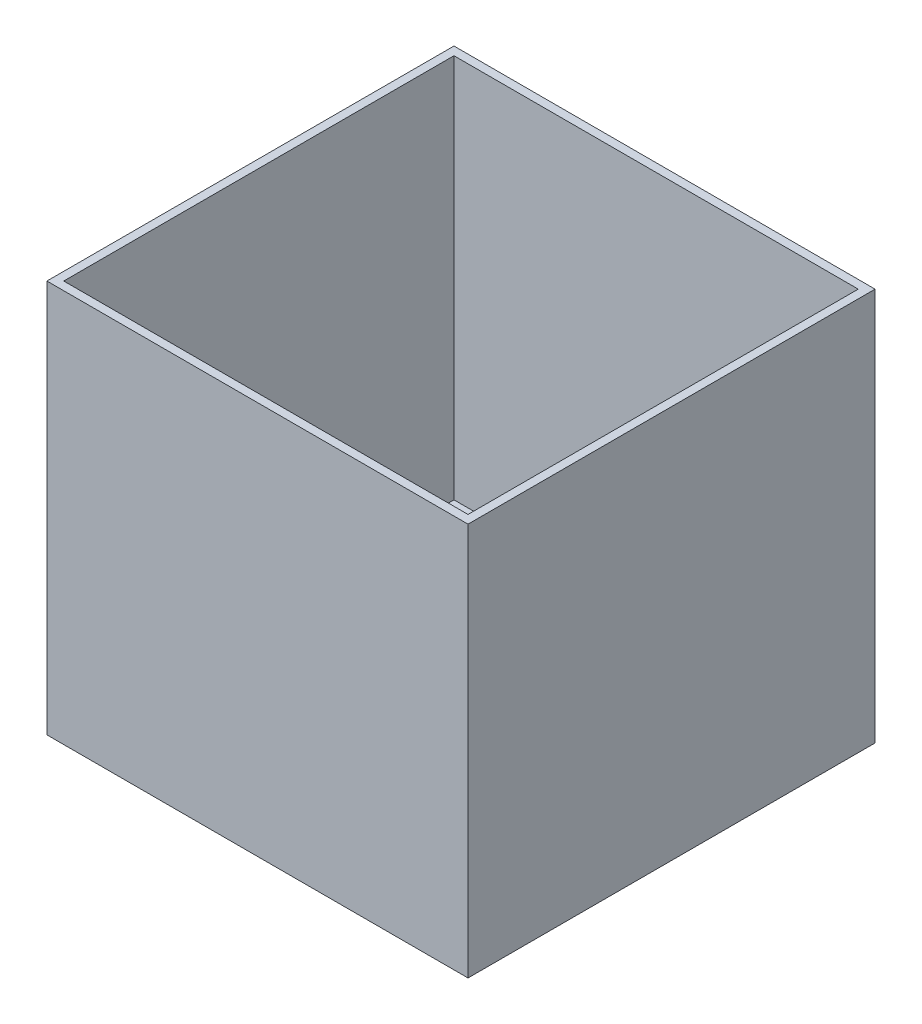
ISO-10303-21;
HEADER;
FILE_DESCRIPTION(('STEP AP214'),'2;1');
FILE_NAME('part.step','',(''),(''),'','','');
FILE_SCHEMA(('AUTOMOTIVE_DESIGN { 1 0 10303 214 1 1 1 1 }'));
ENDSEC;
DATA;
#1=APPLICATION_CONTEXT('core data for automotive mechanical design processes');
#2=APPLICATION_PROTOCOL_DEFINITION('international standard','automotive_design',2000,#1);
#3=PRODUCT_CONTEXT('',#1,'mechanical');
#4=PRODUCT('Part','Part','',(#3));
#5=PRODUCT_RELATED_PRODUCT_CATEGORY('part','',(#4));
#6=PRODUCT_DEFINITION_FORMATION('','',#4);
#7=PRODUCT_DEFINITION_CONTEXT('part definition',#1,'design');
#8=PRODUCT_DEFINITION('design','',#6,#7);
#9=PRODUCT_DEFINITION_SHAPE('','',#8);
#10=(LENGTH_UNIT() NAMED_UNIT(*) SI_UNIT(.MILLI.,.METRE.));
#11=(NAMED_UNIT(*) PLANE_ANGLE_UNIT() SI_UNIT($,.RADIAN.));
#12=(NAMED_UNIT(*) SI_UNIT($,.STERADIAN.) SOLID_ANGLE_UNIT());
#13=UNCERTAINTY_MEASURE_WITH_UNIT(LENGTH_MEASURE(1.E-05),#10,'distance_accuracy_value','');
#14=(GEOMETRIC_REPRESENTATION_CONTEXT(3) GLOBAL_UNCERTAINTY_ASSIGNED_CONTEXT((#13)) GLOBAL_UNIT_ASSIGNED_CONTEXT((#10,
#11,#12)) REPRESENTATION_CONTEXT('',''));
#15=CARTESIAN_POINT('',(0.,0.,0.));
#16=DIRECTION('',(0.,0.,1.));
#17=DIRECTION('',(1.,0.,0.));
#18=AXIS2_PLACEMENT_3D('',#15,#16,#17);
#19=CARTESIAN_POINT('',(72.,140.,-72.5));
#20=DIRECTION('',(-1.,0.,0.));
#21=DIRECTION('',(0.,0.,1.));
#22=AXIS2_PLACEMENT_3D('',#19,#20,#21);
#23=PLANE('',#22);
#24=DIRECTION('',(0.,-1.,0.));
#25=VECTOR('',#24,1.);
#26=CARTESIAN_POINT('',(72.,140.,-69.5));
#27=LINE('',#26,#25);
#28=CARTESIAN_POINT('',(72.,140.,-69.5));
#29=VERTEX_POINT('',#28);
#30=CARTESIAN_POINT('',(72.,3.,-69.5));
#31=VERTEX_POINT('',#30);
#32=EDGE_CURVE('E51',#29,#31,#27,.T.);
#33=ORIENTED_EDGE('',*,*,#32,.T.);
#34=DIRECTION('',(0.,0.,-1.));
#35=VECTOR('',#34,1.);
#36=CARTESIAN_POINT('',(72.,3.,-72.5));
#37=LINE('',#36,#35);
#38=CARTESIAN_POINT('',(72.,3.,69.5));
#39=VERTEX_POINT('',#38);
#40=EDGE_CURVE('E38',#39,#31,#37,.T.);
#41=ORIENTED_EDGE('',*,*,#40,.F.);
#42=DIRECTION('',(0.,-1.,0.));
#43=VECTOR('',#42,1.);
#44=CARTESIAN_POINT('',(72.,140.,69.5));
#45=LINE('',#44,#43);
#46=CARTESIAN_POINT('',(72.,140.,69.5));
#47=VERTEX_POINT('',#46);
#48=EDGE_CURVE('E167',#47,#39,#45,.T.);
#49=ORIENTED_EDGE('',*,*,#48,.F.);
#50=DIRECTION('',(0.,0.,-1.));
#51=VECTOR('',#50,1.);
#52=CARTESIAN_POINT('',(72.,140.,0.));
#53=LINE('',#52,#51);
#54=EDGE_CURVE('E132',#47,#29,#53,.T.);
#55=ORIENTED_EDGE('',*,*,#54,.T.);
#56=EDGE_LOOP('',(#33,#41,#49,#55));
#57=FACE_BOUND('',#56,.T.);
#58=ADVANCED_FACE('F34',(#57),#23,.T.);
#59=CARTESIAN_POINT('',(-75.,140.,-69.5));
#60=DIRECTION('',(0.,0.,1.));
#61=DIRECTION('',(1.,0.,0.));
#62=AXIS2_PLACEMENT_3D('',#59,#60,#61);
#63=PLANE('',#62);
#64=DIRECTION('',(0.,-1.,0.));
#65=VECTOR('',#64,1.);
#66=CARTESIAN_POINT('',(-72.,140.,-69.5));
#67=LINE('',#66,#65);
#68=CARTESIAN_POINT('',(-72.,140.,-69.5));
#69=VERTEX_POINT('',#68);
#70=CARTESIAN_POINT('',(-72.,3.,-69.5));
#71=VERTEX_POINT('',#70);
#72=EDGE_CURVE('E68',#69,#71,#67,.T.);
#73=ORIENTED_EDGE('',*,*,#72,.T.);
#74=DIRECTION('',(-1.,0.,0.));
#75=VECTOR('',#74,1.);
#76=CARTESIAN_POINT('',(-75.,3.,-69.5));
#77=LINE('',#76,#75);
#78=EDGE_CURVE('E166',#31,#71,#77,.T.);
#79=ORIENTED_EDGE('',*,*,#78,.F.);
#80=ORIENTED_EDGE('',*,*,#32,.F.);
#81=DIRECTION('',(-1.,0.,0.));
#82=VECTOR('',#81,1.);
#83=CARTESIAN_POINT('',(0.,140.,-69.5));
#84=LINE('',#83,#82);
#85=EDGE_CURVE('E128',#29,#69,#84,.T.);
#86=ORIENTED_EDGE('',*,*,#85,.T.);
#87=EDGE_LOOP('',(#73,#79,#80,#86));
#88=FACE_BOUND('',#87,.T.);
#89=ADVANCED_FACE('F129',(#88),#63,.T.);
#90=CARTESIAN_POINT('',(-72.,140.,-72.5));
#91=DIRECTION('',(1.,0.,0.));
#92=DIRECTION('',(0.,0.,-1.));
#93=AXIS2_PLACEMENT_3D('',#90,#91,#92);
#94=PLANE('',#93);
#95=DIRECTION('',(0.,-1.,0.));
#96=VECTOR('',#95,1.);
#97=CARTESIAN_POINT('',(-72.,140.,69.5));
#98=LINE('',#97,#96);
#99=CARTESIAN_POINT('',(-72.,140.,69.5));
#100=VERTEX_POINT('',#99);
#101=CARTESIAN_POINT('',(-72.,3.,69.5));
#102=VERTEX_POINT('',#101);
#103=EDGE_CURVE('E11',#100,#102,#98,.T.);
#104=ORIENTED_EDGE('',*,*,#103,.T.);
#105=DIRECTION('',(0.,0.,1.));
#106=VECTOR('',#105,1.);
#107=CARTESIAN_POINT('',(-72.,3.,-72.5));
#108=LINE('',#107,#106);
#109=EDGE_CURVE('E125',#71,#102,#108,.T.);
#110=ORIENTED_EDGE('',*,*,#109,.F.);
#111=ORIENTED_EDGE('',*,*,#72,.F.);
#112=DIRECTION('',(0.,0.,1.));
#113=VECTOR('',#112,1.);
#114=CARTESIAN_POINT('',(-72.,140.,0.));
#115=LINE('',#114,#113);
#116=EDGE_CURVE('E122',#69,#100,#115,.T.);
#117=ORIENTED_EDGE('',*,*,#116,.T.);
#118=EDGE_LOOP('',(#104,#110,#111,#117));
#119=FACE_BOUND('',#118,.T.);
#120=ADVANCED_FACE('F120',(#119),#94,.T.);
#121=CARTESIAN_POINT('',(-75.,140.,69.5));
#122=DIRECTION('',(0.,0.,-1.));
#123=DIRECTION('',(-1.,0.,0.));
#124=AXIS2_PLACEMENT_3D('',#121,#122,#123);
#125=PLANE('',#124);
#126=ORIENTED_EDGE('',*,*,#48,.T.);
#127=DIRECTION('',(1.,0.,0.));
#128=VECTOR('',#127,1.);
#129=CARTESIAN_POINT('',(-75.,3.,69.5));
#130=LINE('',#129,#128);
#131=EDGE_CURVE('E43',#102,#39,#130,.T.);
#132=ORIENTED_EDGE('',*,*,#131,.F.);
#133=ORIENTED_EDGE('',*,*,#103,.F.);
#134=DIRECTION('',(1.,0.,0.));
#135=VECTOR('',#134,1.);
#136=CARTESIAN_POINT('',(0.,140.,69.5));
#137=LINE('',#136,#135);
#138=EDGE_CURVE('E136',#100,#47,#137,.T.);
#139=ORIENTED_EDGE('',*,*,#138,.T.);
#140=EDGE_LOOP('',(#126,#132,#133,#139));
#141=FACE_BOUND('',#140,.T.);
#142=ADVANCED_FACE('F172',(#141),#125,.T.);
#143=CARTESIAN_POINT('',(0.,3.,0.));
#144=DIRECTION('',(0.,1.,0.));
#145=DIRECTION('',(0.,0.,1.));
#146=AXIS2_PLACEMENT_3D('',#143,#144,#145);
#147=PLANE('',#146);
#148=ORIENTED_EDGE('',*,*,#40,.T.);
#149=ORIENTED_EDGE('',*,*,#78,.T.);
#150=ORIENTED_EDGE('',*,*,#109,.T.);
#151=ORIENTED_EDGE('',*,*,#131,.T.);
#152=EDGE_LOOP('',(#148,#149,#150,#151));
#153=FACE_BOUND('',#152,.T.);
#154=ADVANCED_FACE('F36',(#153),#147,.T.);
#155=CARTESIAN_POINT('',(75.,140.,-72.5));
#156=DIRECTION('',(-1.,0.,0.));
#157=DIRECTION('',(0.,0.,1.));
#158=AXIS2_PLACEMENT_3D('',#155,#156,#157);
#159=PLANE('',#158);
#160=DIRECTION('',(0.,0.,-1.));
#161=VECTOR('',#160,1.);
#162=CARTESIAN_POINT('',(75.,0.,-72.5));
#163=LINE('',#162,#161);
#164=CARTESIAN_POINT('',(75.,0.,72.5));
#165=VERTEX_POINT('',#164);
#166=CARTESIAN_POINT('',(75.,0.,-72.5));
#167=VERTEX_POINT('',#166);
#168=EDGE_CURVE('E138',#165,#167,#163,.T.);
#169=ORIENTED_EDGE('',*,*,#168,.T.);
#170=DIRECTION('',(0.,-1.,0.));
#171=VECTOR('',#170,1.);
#172=CARTESIAN_POINT('',(75.,140.,-72.5));
#173=LINE('',#172,#171);
#174=CARTESIAN_POINT('',(75.,140.,-72.5));
#175=VERTEX_POINT('',#174);
#176=EDGE_CURVE('E160',#175,#167,#173,.T.);
#177=ORIENTED_EDGE('',*,*,#176,.F.);
#178=DIRECTION('',(0.,0.,-1.));
#179=VECTOR('',#178,1.);
#180=CARTESIAN_POINT('',(75.,140.,-72.5));
#181=LINE('',#180,#179);
#182=CARTESIAN_POINT('',(75.,140.,72.5));
#183=VERTEX_POINT('',#182);
#184=EDGE_CURVE('E142',#183,#175,#181,.T.);
#185=ORIENTED_EDGE('',*,*,#184,.F.);
#186=DIRECTION('',(0.,-1.,0.));
#187=VECTOR('',#186,1.);
#188=CARTESIAN_POINT('',(75.,140.,72.5));
#189=LINE('',#188,#187);
#190=EDGE_CURVE('E148',#183,#165,#189,.T.);
#191=ORIENTED_EDGE('',*,*,#190,.T.);
#192=EDGE_LOOP('',(#169,#177,#185,#191));
#193=FACE_BOUND('',#192,.T.);
#194=ADVANCED_FACE('F178',(#193),#159,.F.);
#195=CARTESIAN_POINT('',(-75.,140.,-72.5));
#196=DIRECTION('',(0.,0.,1.));
#197=DIRECTION('',(1.,0.,0.));
#198=AXIS2_PLACEMENT_3D('',#195,#196,#197);
#199=PLANE('',#198);
#200=DIRECTION('',(-1.,0.,0.));
#201=VECTOR('',#200,1.);
#202=CARTESIAN_POINT('',(-75.,0.,-72.5));
#203=LINE('',#202,#201);
#204=CARTESIAN_POINT('',(-75.,0.,-72.5));
#205=VERTEX_POINT('',#204);
#206=EDGE_CURVE('E151',#167,#205,#203,.T.);
#207=ORIENTED_EDGE('',*,*,#206,.T.);
#208=DIRECTION('',(0.,-1.,0.));
#209=VECTOR('',#208,1.);
#210=CARTESIAN_POINT('',(-75.,140.,-72.5));
#211=LINE('',#210,#209);
#212=CARTESIAN_POINT('',(-75.,140.,-72.5));
#213=VERTEX_POINT('',#212);
#214=EDGE_CURVE('E158',#213,#205,#211,.T.);
#215=ORIENTED_EDGE('',*,*,#214,.F.);
#216=DIRECTION('',(-1.,0.,0.));
#217=VECTOR('',#216,1.);
#218=CARTESIAN_POINT('',(-75.,140.,-72.5));
#219=LINE('',#218,#217);
#220=EDGE_CURVE('E109',#175,#213,#219,.T.);
#221=ORIENTED_EDGE('',*,*,#220,.F.);
#222=ORIENTED_EDGE('',*,*,#176,.T.);
#223=EDGE_LOOP('',(#207,#215,#221,#222));
#224=FACE_BOUND('',#223,.T.);
#225=ADVANCED_FACE('F189',(#224),#199,.F.);
#226=CARTESIAN_POINT('',(-75.,140.,-72.5));
#227=DIRECTION('',(1.,0.,0.));
#228=DIRECTION('',(0.,0.,-1.));
#229=AXIS2_PLACEMENT_3D('',#226,#227,#228);
#230=PLANE('',#229);
#231=DIRECTION('',(0.,0.,1.));
#232=VECTOR('',#231,1.);
#233=CARTESIAN_POINT('',(-75.,0.,-72.5));
#234=LINE('',#233,#232);
#235=CARTESIAN_POINT('',(-75.,0.,72.5));
#236=VERTEX_POINT('',#235);
#237=EDGE_CURVE('E95',#205,#236,#234,.T.);
#238=ORIENTED_EDGE('',*,*,#237,.T.);
#239=DIRECTION('',(0.,-1.,0.));
#240=VECTOR('',#239,1.);
#241=CARTESIAN_POINT('',(-75.,140.,72.5));
#242=LINE('',#241,#240);
#243=CARTESIAN_POINT('',(-75.,140.,72.5));
#244=VERTEX_POINT('',#243);
#245=EDGE_CURVE('E156',#244,#236,#242,.T.);
#246=ORIENTED_EDGE('',*,*,#245,.F.);
#247=DIRECTION('',(0.,0.,1.));
#248=VECTOR('',#247,1.);
#249=CARTESIAN_POINT('',(-75.,140.,-72.5));
#250=LINE('',#249,#248);
#251=EDGE_CURVE('E145',#213,#244,#250,.T.);
#252=ORIENTED_EDGE('',*,*,#251,.F.);
#253=ORIENTED_EDGE('',*,*,#214,.T.);
#254=EDGE_LOOP('',(#238,#246,#252,#253));
#255=FACE_BOUND('',#254,.T.);
#256=ADVANCED_FACE('F193',(#255),#230,.F.);
#257=CARTESIAN_POINT('',(-75.,140.,72.5));
#258=DIRECTION('',(0.,0.,-1.));
#259=DIRECTION('',(-1.,0.,0.));
#260=AXIS2_PLACEMENT_3D('',#257,#258,#259);
#261=PLANE('',#260);
#262=DIRECTION('',(1.,0.,0.));
#263=VECTOR('',#262,1.);
#264=CARTESIAN_POINT('',(-75.,0.,72.5));
#265=LINE('',#264,#263);
#266=EDGE_CURVE('E101',#236,#165,#265,.T.);
#267=ORIENTED_EDGE('',*,*,#266,.T.);
#268=ORIENTED_EDGE('',*,*,#190,.F.);
#269=DIRECTION('',(1.,0.,0.));
#270=VECTOR('',#269,1.);
#271=CARTESIAN_POINT('',(-75.,140.,72.5));
#272=LINE('',#271,#270);
#273=EDGE_CURVE('E77',#244,#183,#272,.T.);
#274=ORIENTED_EDGE('',*,*,#273,.F.);
#275=ORIENTED_EDGE('',*,*,#245,.T.);
#276=EDGE_LOOP('',(#267,#268,#274,#275));
#277=FACE_BOUND('',#276,.T.);
#278=ADVANCED_FACE('F196',(#277),#261,.F.);
#279=CARTESIAN_POINT('',(0.,140.,0.));
#280=DIRECTION('',(0.,1.,0.));
#281=DIRECTION('',(0.,0.,1.));
#282=AXIS2_PLACEMENT_3D('',#279,#280,#281);
#283=PLANE('',#282);
#284=ORIENTED_EDGE('',*,*,#54,.F.);
#285=ORIENTED_EDGE('',*,*,#138,.F.);
#286=ORIENTED_EDGE('',*,*,#116,.F.);
#287=ORIENTED_EDGE('',*,*,#85,.F.);
#288=EDGE_LOOP('',(#284,#285,#286,#287));
#289=FACE_BOUND('',#288,.T.);
#290=ORIENTED_EDGE('',*,*,#184,.T.);
#291=ORIENTED_EDGE('',*,*,#220,.T.);
#292=ORIENTED_EDGE('',*,*,#251,.T.);
#293=ORIENTED_EDGE('',*,*,#273,.T.);
#294=EDGE_LOOP('',(#290,#291,#292,#293));
#295=FACE_BOUND('',#294,.T.);
#296=ADVANCED_FACE('F134',(#289,#295),#283,.T.);
#297=CARTESIAN_POINT('',(0.,0.,0.));
#298=DIRECTION('',(0.,1.,0.));
#299=DIRECTION('',(0.,0.,1.));
#300=AXIS2_PLACEMENT_3D('',#297,#298,#299);
#301=PLANE('',#300);
#302=ORIENTED_EDGE('',*,*,#168,.F.);
#303=ORIENTED_EDGE('',*,*,#266,.F.);
#304=ORIENTED_EDGE('',*,*,#237,.F.);
#305=ORIENTED_EDGE('',*,*,#206,.F.);
#306=EDGE_LOOP('',(#302,#303,#304,#305));
#307=FACE_BOUND('',#306,.T.);
#308=ADVANCED_FACE('F199',(#307),#301,.F.);
#309=CLOSED_SHELL('',(#58,#89,#120,#142,#154,#194,#225,#256,#278,#296,#308));
#310=MANIFOLD_SOLID_BREP('B2',#309);
#311=ADVANCED_BREP_SHAPE_REPRESENTATION('',(#18,#310),#14);
#312=SHAPE_DEFINITION_REPRESENTATION(#9,#311);
ENDSEC;
END-ISO-10303-21;
